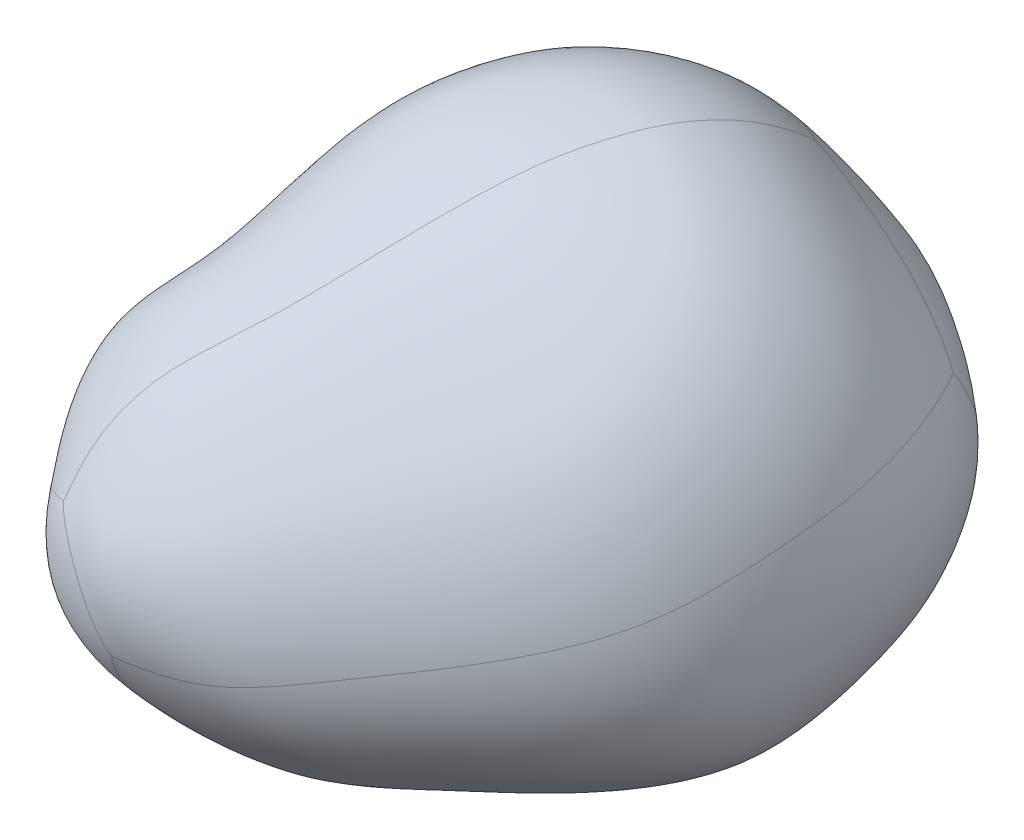
ISO-10303-21;
HEADER;
FILE_DESCRIPTION(('STEP AP214'),'2;1');
FILE_NAME('part.step','',(''),(''),'','','');
FILE_SCHEMA(('AUTOMOTIVE_DESIGN { 1 0 10303 214 1 1 1 1 }'));
ENDSEC;
DATA;
#1=APPLICATION_CONTEXT('core data for automotive mechanical design processes');
#2=APPLICATION_PROTOCOL_DEFINITION('international standard','automotive_design',2000,#1);
#3=PRODUCT_CONTEXT('',#1,'mechanical');
#4=PRODUCT('Part','Part','',(#3));
#5=PRODUCT_RELATED_PRODUCT_CATEGORY('part','',(#4));
#6=PRODUCT_DEFINITION_FORMATION('','',#4);
#7=PRODUCT_DEFINITION_CONTEXT('part definition',#1,'design');
#8=PRODUCT_DEFINITION('design','',#6,#7);
#9=PRODUCT_DEFINITION_SHAPE('','',#8);
#10=(LENGTH_UNIT() NAMED_UNIT(*) SI_UNIT(.MILLI.,.METRE.));
#11=(NAMED_UNIT(*) PLANE_ANGLE_UNIT() SI_UNIT($,.RADIAN.));
#12=(NAMED_UNIT(*) SI_UNIT($,.STERADIAN.) SOLID_ANGLE_UNIT());
#13=UNCERTAINTY_MEASURE_WITH_UNIT(LENGTH_MEASURE(1.E-05),#10,'distance_accuracy_value','');
#14=(GEOMETRIC_REPRESENTATION_CONTEXT(3) GLOBAL_UNCERTAINTY_ASSIGNED_CONTEXT((#13)) GLOBAL_UNIT_ASSIGNED_CONTEXT((#10,
#11,#12)) REPRESENTATION_CONTEXT('',''));
#15=CARTESIAN_POINT('',(0.,0.,0.));
#16=DIRECTION('',(0.,0.,1.));
#17=DIRECTION('',(1.,0.,0.));
#18=AXIS2_PLACEMENT_3D('',#15,#16,#17);
#19=CARTESIAN_POINT('',(-686.42291163055,1282.70666485305,10.6136811677442));
#20=CARTESIAN_POINT('',(-687.093200637764,1282.88853351169,10.5124560797397));
#21=CARTESIAN_POINT('',(-689.119582878825,1283.61745505874,9.80747683091503));
#22=CARTESIAN_POINT('',(-691.409614309493,1286.1212048528,9.66454485203231));
#23=CARTESIAN_POINT('',(-691.8476225779,1288.3002904802,10.2041170140587));
#24=CARTESIAN_POINT('',(-691.908078071692,1288.99320668907,10.2386396299272));
#25=CARTESIAN_POINT('',(-686.114869144333,1282.34408943839,10.1531654192161));
#26=CARTESIAN_POINT('',(-687.147404672565,1282.34525134099,9.49019949464606));
#27=CARTESIAN_POINT('',(-689.34960200637,1282.98717520934,8.4788118063687));
#28=CARTESIAN_POINT('',(-691.877866697639,1285.66932077802,8.35125023060825));
#29=CARTESIAN_POINT('',(-692.253702427534,1288.04240599118,9.23253822877614));
#30=CARTESIAN_POINT('',(-692.141345743401,1289.210722549,9.77011154523115));
#31=CARTESIAN_POINT('',(-684.674634541812,1281.17045683436,8.51633098668324));
#32=CARTESIAN_POINT('',(-686.053718999425,1281.27644974596,7.70583653770232));
#33=CARTESIAN_POINT('',(-689.076122784645,1282.33069227273,6.4876607775005));
#34=CARTESIAN_POINT('',(-692.568304038862,1285.91611908638,6.31859419193949));
#35=CARTESIAN_POINT('',(-693.181903206195,1289.07151461582,7.42484161968595));
#36=CARTESIAN_POINT('',(-693.080789707073,1290.59529470529,8.07253791178796));
#37=CARTESIAN_POINT('',(-681.620453632023,1279.14049088634,4.51940701699092));
#38=CARTESIAN_POINT('',(-683.696286240225,1279.33807292889,3.40556901370574));
#39=CARTESIAN_POINT('',(-688.337675485142,1280.96703779058,1.79116590999492));
#40=CARTESIAN_POINT('',(-693.678791142445,1285.81664285559,1.47380131925525));
#41=CARTESIAN_POINT('',(-694.383414425187,1290.21593355715,3.345163323218));
#42=CARTESIAN_POINT('',(-694.105374323754,1292.37268747619,4.31836859647923));
#43=CARTESIAN_POINT('',(-677.084231777265,1279.14000389249,0.796351925249876));
#44=CARTESIAN_POINT('',(-679.313242319377,1279.22393255586,-0.383227826918756));
#45=CARTESIAN_POINT('',(-684.531380755252,1280.65954170552,-2.13027967370924));
#46=CARTESIAN_POINT('',(-692.291807762562,1286.10757527401,-2.37146180569254));
#47=CARTESIAN_POINT('',(-693.069346619984,1291.02753702183,0.130214183151319));
#48=CARTESIAN_POINT('',(-692.673874841855,1293.47851130268,1.26386509136313));
#49=CARTESIAN_POINT('',(-672.484418517321,1279.160343747,-2.79936903690772));
#50=CARTESIAN_POINT('',(-674.958806307733,1279.18370066044,-3.97698591478032));
#51=CARTESIAN_POINT('',(-681.0144033372,1280.5536472085,-5.65392708944938));
#52=CARTESIAN_POINT('',(-691.860047135952,1286.65307915905,-5.37526087814403));
#53=CARTESIAN_POINT('',(-692.734600000381,1291.92655549921,-2.47703549844126));
#54=CARTESIAN_POINT('',(-692.230934225644,1294.59940439324,-1.28738484312691));
#55=CARTESIAN_POINT('',(-668.427144473369,1279.95245622681,-6.81683013840246));
#56=CARTESIAN_POINT('',(-671.081772309839,1279.91139957004,-7.91989002078143));
#57=CARTESIAN_POINT('',(-677.650013192386,1281.17337774761,-9.44521435466294));
#58=CARTESIAN_POINT('',(-690.762878757641,1288.07081222915,-9.43403816127301));
#59=CARTESIAN_POINT('',(-691.685197110129,1293.49362928346,-6.31268773454909));
#60=CARTESIAN_POINT('',(-691.348352778073,1296.15812834043,-5.12739565255575));
#61=CARTESIAN_POINT('',(-667.387450801063,1281.06373602765,-10.8102788095088));
#62=CARTESIAN_POINT('',(-670.11018795594,1280.98777794852,-11.8602692286205));
#63=CARTESIAN_POINT('',(-676.612947349273,1282.25959659921,-13.2865590274581));
#64=CARTESIAN_POINT('',(-688.590333961783,1289.10053626142,-13.2298024607305));
#65=CARTESIAN_POINT('',(-690.09302408472,1294.81230980328,-10.4858952907197));
#66=CARTESIAN_POINT('',(-689.983872041131,1297.52784683628,-9.38897231943302));
#67=CARTESIAN_POINT('',(-666.794398610092,1283.11117136481,-14.6489177834959));
#68=CARTESIAN_POINT('',(-669.415462502165,1283.0050422679,-15.5803580086399));
#69=CARTESIAN_POINT('',(-675.44724265585,1284.20738289869,-16.8186649282753));
#70=CARTESIAN_POINT('',(-685.542170643042,1290.56526226626,-16.7198798660345));
#71=CARTESIAN_POINT('',(-687.531476708449,1296.20979139775,-14.5245271264415));
#72=CARTESIAN_POINT('',(-687.656808098997,1298.80701812307,-13.5843769834317));
#73=CARTESIAN_POINT('',(-666.142237451677,1285.27283598828,-17.4314258739017));
#74=CARTESIAN_POINT('',(-668.555853562239,1285.19837109628,-18.2840876684652));
#75=CARTESIAN_POINT('',(-674.110296009377,1286.32326986979,-19.5042139428517));
#76=CARTESIAN_POINT('',(-682.728569881099,1292.07812345255,-19.3836341560662));
#77=CARTESIAN_POINT('',(-684.76325754947,1297.21885740554,-17.6152997813946));
#78=CARTESIAN_POINT('',(-684.963731264138,1299.58453153542,-16.7941283890536));
#79=CARTESIAN_POINT('',(-665.861682059292,1288.3609445699,-20.0211985575345));
#80=CARTESIAN_POINT('',(-667.893113435887,1288.32353567233,-20.7333579907715));
#81=CARTESIAN_POINT('',(-672.568032124908,1289.28958610769,-21.8469700343674));
#82=CARTESIAN_POINT('',(-679.086040805524,1294.02486811409,-21.7133620851019));
#83=CARTESIAN_POINT('',(-681.018851553783,1298.28968075662,-20.5000434118361));
#84=CARTESIAN_POINT('',(-681.279950893226,1300.25256135101,-19.8572901379306));
#85=CARTESIAN_POINT('',(-665.552043469771,1291.475283705,-21.1107903059627));
#86=CARTESIAN_POINT('',(-667.074358700396,1291.56764215621,-21.733166431614));
#87=CARTESIAN_POINT('',(-670.575492500916,1292.51853431343,-22.8887551729772));
#88=CARTESIAN_POINT('',(-675.674054926746,1296.32453808077,-22.7112967364734));
#89=CARTESIAN_POINT('',(-677.37018947025,1299.48607415632,-21.5684778709439));
#90=CARTESIAN_POINT('',(-677.715522137071,1300.93555795033,-21.0155570908403));
#91=CARTESIAN_POINT('',(-665.598886444234,1292.20966830191,-21.321841883444));
#92=CARTESIAN_POINT('',(-666.383465546783,1292.62303982597,-21.738555735032));
#93=CARTESIAN_POINT('',(-669.697137822839,1293.90171225334,-22.9821934358503));
#94=CARTESIAN_POINT('',(-674.262867005322,1297.3343262859,-22.784973234695));
#95=CARTESIAN_POINT('',(-676.267293612278,1300.29033670793,-21.6229092356498));
#96=CARTESIAN_POINT('',(-676.865147342805,1300.98857172006,-21.2361515940119));
#97=(BOUNDED_SURFACE() B_SPLINE_SURFACE(3,3,((#19,#20,#21,#22,#23,#24),(#25,#26,#27,#28,#29,
#30),(#31,#32,#33,#34,#35,#36),(#37,#38,#39,#40,#41,#42),(#43,#44,#45,#46,#47,#48),(#49,#50,#51,
#52,#53,#54),(#55,#56,#57,#58,#59,#60),(#61,#62,#63,#64,#65,#66),(#67,#68,#69,#70,#71,#72),(#73,
#74,#75,#76,#77,#78),(#79,#80,#81,#82,#83,#84),(#85,#86,#87,#88,#89,#90),(#91,#92,#93,#94,#95,
#96)),.UNSPECIFIED.,.F.,.F.,.F.) B_SPLINE_SURFACE_WITH_KNOTS((4,1,1,1,1,1,1,1,1,1,4),(4,1,1,4),
(0.,1.,2.,3.,4.,5.,6.,7.,8.,9.,10.),(0.,1.,2.,3.),
.UNSPECIFIED.) GEOMETRIC_REPRESENTATION_ITEM() RATIONAL_B_SPLINE_SURFACE(((0.75,1.,1.,1.,1.,
0.75),(1.,1.,1.,1.,1.,1.),(1.,1.,1.,1.,1.,1.),(1.,1.,1.,1.,1.,1.),(1.,1.,1.,1.,1.,1.),(1.,1.,1.,
1.,1.,1.),(1.,1.,1.,1.,1.,1.),(1.,1.,1.,1.,1.,1.),(1.,1.,1.,1.,1.,1.),(1.,1.,1.,1.,1.,1.),(1.,
1.,1.,1.,1.,1.),(1.,1.,1.,1.,1.,1.),(0.75,1.,1.,1.,1.,0.75))) REPRESENTATION_ITEM('') SURFACE());
#98=CARTESIAN_POINT('',(-686.42291163055,1282.70666485305,10.6136811677442));
#99=CARTESIAN_POINT('',(-686.114869144333,1282.34408943839,10.1531654192161));
#100=CARTESIAN_POINT('',(-684.674634541812,1281.17045683436,8.51633098668324));
#101=CARTESIAN_POINT('',(-681.620453632023,1279.14049088634,4.51940701699092));
#102=CARTESIAN_POINT('',(-677.084231777265,1279.14000389249,0.796351925249876));
#103=CARTESIAN_POINT('',(-672.484418517321,1279.160343747,-2.79936903690772));
#104=CARTESIAN_POINT('',(-668.427144473369,1279.95245622681,-6.81683013840246));
#105=CARTESIAN_POINT('',(-667.387450801063,1281.06373602765,-10.8102788095088));
#106=CARTESIAN_POINT('',(-666.794398610092,1283.11117136481,-14.6489177834959));
#107=CARTESIAN_POINT('',(-666.142237451677,1285.27283598828,-17.4314258739017));
#108=CARTESIAN_POINT('',(-665.861682059292,1288.3609445699,-20.0211985575345));
#109=CARTESIAN_POINT('',(-665.552043469771,1291.475283705,-21.1107903059627));
#110=CARTESIAN_POINT('',(-665.598886444234,1292.20966830191,-21.321841883444));
#111=(BOUNDED_CURVE() B_SPLINE_CURVE(3,(#98,#99,#100,#101,#102,#103,#104,#105,#106,#107,#108,
#109,#110),.UNSPECIFIED.,.F.,.F.) B_SPLINE_CURVE_WITH_KNOTS((4,1,1,1,1,1,1,1,1,1,4),(0.,1.,2.,
3.,4.,5.,6.,7.,8.,9.,10.),
.UNSPECIFIED.) CURVE() GEOMETRIC_REPRESENTATION_ITEM() RATIONAL_B_SPLINE_CURVE((0.75,1.,1.,1.,
1.,1.,1.,1.,1.,1.,1.,1.,0.75)) REPRESENTATION_ITEM(''));
#112=CARTESIAN_POINT('',(-665.598886444234,1292.20966830191,-21.3218418834439));
#113=VERTEX_POINT('',#112);
#114=CARTESIAN_POINT('',(-686.42291163055,1282.70666485305,10.6136811677441));
#115=VERTEX_POINT('',#114);
#116=EDGE_CURVE('E89',#113,#115,#111,.F.);
#117=CARTESIAN_POINT('',(-691.908078071692,1288.99320668907,10.2386396299272));
#118=CARTESIAN_POINT('',(-691.8476225779,1288.3002904802,10.2041170140587));
#119=CARTESIAN_POINT('',(-691.409614309493,1286.1212048528,9.66454485203231));
#120=CARTESIAN_POINT('',(-689.119582878825,1283.61745505874,9.80747683091503));
#121=CARTESIAN_POINT('',(-687.093200637764,1282.88853351169,10.5124560797397));
#122=CARTESIAN_POINT('',(-686.42291163055,1282.70666485305,10.6136811677442));
#123=(BOUNDED_CURVE() B_SPLINE_CURVE(3,(#117,#118,#119,#120,#121,#122),.UNSPECIFIED.,.F.,
.F.) B_SPLINE_CURVE_WITH_KNOTS((4,1,1,4),(0.,1.,2.,3.),
.UNSPECIFIED.) CURVE() GEOMETRIC_REPRESENTATION_ITEM() RATIONAL_B_SPLINE_CURVE((0.75,1.,1.,1.,
1.,0.75)) REPRESENTATION_ITEM(''));
#124=CARTESIAN_POINT('',(-691.908078071692,1288.99320668907,10.2386396299273));
#125=VERTEX_POINT('',#124);
#126=EDGE_CURVE('E150',#115,#125,#123,.F.);
#127=CARTESIAN_POINT('',(-676.865147342805,1300.98857172006,-21.2361515940119));
#128=CARTESIAN_POINT('',(-677.715522137071,1300.93555795033,-21.0155570908403));
#129=CARTESIAN_POINT('',(-681.279950893226,1300.25256135101,-19.8572901379306));
#130=CARTESIAN_POINT('',(-684.963731264138,1299.58453153542,-16.7941283890536));
#131=CARTESIAN_POINT('',(-687.656808098997,1298.80701812307,-13.5843769834317));
#132=CARTESIAN_POINT('',(-689.983872041131,1297.52784683628,-9.38897231943302));
#133=CARTESIAN_POINT('',(-691.348352778073,1296.15812834043,-5.12739565255575));
#134=CARTESIAN_POINT('',(-692.230934225644,1294.59940439324,-1.28738484312691));
#135=CARTESIAN_POINT('',(-692.673874841855,1293.47851130268,1.26386509136313));
#136=CARTESIAN_POINT('',(-694.105374323754,1292.37268747619,4.31836859647923));
#137=CARTESIAN_POINT('',(-693.080789707073,1290.59529470529,8.07253791178796));
#138=CARTESIAN_POINT('',(-692.141345743401,1289.210722549,9.77011154523115));
#139=CARTESIAN_POINT('',(-691.908078071692,1288.99320668907,10.2386396299272));
#140=(BOUNDED_CURVE() B_SPLINE_CURVE(3,(#127,#128,#129,#130,#131,#132,#133,#134,#135,#136,#137,
#138,#139),.UNSPECIFIED.,.F.,.F.) B_SPLINE_CURVE_WITH_KNOTS((4,1,1,1,1,1,1,1,1,1,4),(0.,1.,2.,
3.,4.,5.,6.,7.,8.,9.,10.),
.UNSPECIFIED.) CURVE() GEOMETRIC_REPRESENTATION_ITEM() RATIONAL_B_SPLINE_CURVE((0.75,1.,1.,1.,
1.,1.,1.,1.,1.,1.,1.,1.,0.75)) REPRESENTATION_ITEM(''));
#141=CARTESIAN_POINT('',(-676.865147342805,1300.98857172006,-21.2361515940119));
#142=VERTEX_POINT('',#141);
#143=EDGE_CURVE('E102',#125,#142,#140,.F.);
#144=CARTESIAN_POINT('',(-665.598886444234,1292.20966830191,-21.321841883444));
#145=CARTESIAN_POINT('',(-666.383465546783,1292.62303982597,-21.738555735032));
#146=CARTESIAN_POINT('',(-669.697137822839,1293.90171225334,-22.9821934358503));
#147=CARTESIAN_POINT('',(-674.262867005322,1297.3343262859,-22.784973234695));
#148=CARTESIAN_POINT('',(-676.267293612278,1300.29033670793,-21.6229092356498));
#149=CARTESIAN_POINT('',(-676.865147342805,1300.98857172006,-21.2361515940119));
#150=(BOUNDED_CURVE() B_SPLINE_CURVE(3,(#144,#145,#146,#147,#148,#149),.UNSPECIFIED.,.F.,
.F.) B_SPLINE_CURVE_WITH_KNOTS((4,1,1,4),(0.,1.,2.,3.),
.UNSPECIFIED.) CURVE() GEOMETRIC_REPRESENTATION_ITEM() RATIONAL_B_SPLINE_CURVE((0.75,1.,1.,1.,
1.,0.75)) REPRESENTATION_ITEM(''));
#151=EDGE_CURVE('E101',#142,#113,#150,.F.);
#152=ORIENTED_EDGE('',*,*,#116,.T.);
#153=ORIENTED_EDGE('',*,*,#126,.T.);
#154=ORIENTED_EDGE('',*,*,#143,.T.);
#155=ORIENTED_EDGE('',*,*,#151,.T.);
#156=EDGE_LOOP('',(#152,#153,#154,#155));
#157=FACE_BOUND('',#156,.T.);
#158=ADVANCED_FACE('F40',(#157),#97,.F.);
#159=CARTESIAN_POINT('',(-665.598886444234,1292.20966830191,-21.321841883444));
#160=CARTESIAN_POINT('',(-666.383465546783,1292.62303982597,-21.738555735032));
#161=CARTESIAN_POINT('',(-669.697137822839,1293.90171225334,-22.9821934358503));
#162=CARTESIAN_POINT('',(-674.262867005322,1297.3343262859,-22.784973234695));
#163=CARTESIAN_POINT('',(-676.267293612278,1300.29033670793,-21.6229092356498));
#164=CARTESIAN_POINT('',(-676.865147342805,1300.98857172006,-21.2361515940119));
#165=CARTESIAN_POINT('',(-664.86115031617,1292.53068137475,-21.116179609359));
#166=CARTESIAN_POINT('',(-665.692572393182,1293.67843749572,-21.7439450384282));
#167=CARTESIAN_POINT('',(-668.818783144761,1295.28489019326,-23.0756316987124));
#168=CARTESIAN_POINT('',(-672.851679083909,1298.34411449104,-22.8586497329164));
#169=CARTESIAN_POINT('',(-675.164397754296,1301.09459925954,-21.6773406003557));
#170=CARTESIAN_POINT('',(-676.612626279087,1301.73982050193,-21.0699884555459));
#171=CARTESIAN_POINT('',(-662.594677815706,1293.31015264849,-19.9600961151038));
#172=CARTESIAN_POINT('',(-663.747754514224,1294.65592169084,-20.7656938112249));
#173=CARTESIAN_POINT('',(-667.297904056435,1297.5886537472,-22.4075996116167));
#174=CARTESIAN_POINT('',(-670.618913276992,1300.0835973449,-22.1554210744634));
#175=CARTESIAN_POINT('',(-674.401476405907,1303.11525606632,-20.8266316000605));
#176=CARTESIAN_POINT('',(-676.073763666764,1304.06834845557,-20.1102018279336));
#177=CARTESIAN_POINT('',(-660.926960995874,1295.88388375589,-18.1013294311311));
#178=CARTESIAN_POINT('',(-662.119046255161,1296.9534225298,-19.0722785522677));
#179=CARTESIAN_POINT('',(-665.31051099484,1300.01296458609,-20.452973982058));
#180=CARTESIAN_POINT('',(-668.406067105772,1302.3700931522,-20.3501596015209));
#181=CARTESIAN_POINT('',(-672.190754374226,1305.11899662417,-19.407942003383));
#182=CARTESIAN_POINT('',(-673.525827047994,1306.25660129213,-18.7071390379707));
#183=CARTESIAN_POINT('',(-661.021209873142,1298.02208714574,-17.1648614489135));
#184=CARTESIAN_POINT('',(-661.912434136778,1298.76471151157,-18.0206065657238));
#185=CARTESIAN_POINT('',(-663.92937203237,1301.31011274233,-18.4391264629946));
#186=CARTESIAN_POINT('',(-667.336751897799,1303.93565126776,-18.4453218524157));
#187=CARTESIAN_POINT('',(-670.327421229956,1305.58505983533,-18.3388377803774));
#188=CARTESIAN_POINT('',(-671.227587167795,1306.49458069563,-17.7495212825345));
#189=CARTESIAN_POINT('',(-661.047260040231,1298.61720564721,-16.7166215073291));
#190=CARTESIAN_POINT('',(-661.505897255577,1299.28607708086,-16.9203740949258));
#191=CARTESIAN_POINT('',(-663.286186031787,1301.85419866751,-17.0512913244717));
#192=CARTESIAN_POINT('',(-666.877951441682,1304.74337883645,-17.1884671165909));
#193=CARTESIAN_POINT('',(-669.820629045091,1306.18739743648,-17.4037340005691));
#194=CARTESIAN_POINT('',(-670.589670398601,1306.5929654763,-17.3225575952802));
#195=(BOUNDED_SURFACE() B_SPLINE_SURFACE(3,3,((#159,#160,#161,#162,#163,#164),(#165,#166,#167,
#168,#169,#170),(#171,#172,#173,#174,#175,#176),(#177,#178,#179,#180,#181,#182),(#183,#184,#185,
#186,#187,#188),(#189,#190,#191,#192,#193,#194)),.UNSPECIFIED.,.F.,.F.,
.F.) B_SPLINE_SURFACE_WITH_KNOTS((4,1,1,4),(4,1,1,4),(0.,1.,2.,3.),(0.,1.,2.,3.),
.UNSPECIFIED.) GEOMETRIC_REPRESENTATION_ITEM() RATIONAL_B_SPLINE_SURFACE(((0.75,1.,1.,1.,1.,
0.75),(1.,1.,1.,1.,1.,1.),(1.,1.,1.,1.,1.,1.),(1.,1.,1.,1.,1.,1.),(1.,1.,1.,1.,1.,1.),(0.75,1.,
1.,1.,1.,0.75))) REPRESENTATION_ITEM('') SURFACE());
#196=CARTESIAN_POINT('',(-661.047260040231,1298.61720564721,-16.7166215073291));
#197=CARTESIAN_POINT('',(-661.021209873142,1298.02208714574,-17.1648614489135));
#198=CARTESIAN_POINT('',(-660.926960995874,1295.88388375589,-18.1013294311311));
#199=CARTESIAN_POINT('',(-662.594677815706,1293.31015264849,-19.9600961151038));
#200=CARTESIAN_POINT('',(-664.86115031617,1292.53068137475,-21.116179609359));
#201=CARTESIAN_POINT('',(-665.598886444234,1292.20966830191,-21.321841883444));
#202=(BOUNDED_CURVE() B_SPLINE_CURVE(3,(#196,#197,#198,#199,#200,#201),.UNSPECIFIED.,.F.,
.F.) B_SPLINE_CURVE_WITH_KNOTS((4,1,1,4),(0.,1.,2.,3.),
.UNSPECIFIED.) CURVE() GEOMETRIC_REPRESENTATION_ITEM() RATIONAL_B_SPLINE_CURVE((0.75,1.,1.,1.,
1.,0.75)) REPRESENTATION_ITEM(''));
#203=CARTESIAN_POINT('',(-661.047260040231,1298.61720564721,-16.7166215073291));
#204=VERTEX_POINT('',#203);
#205=EDGE_CURVE('E93',#204,#113,#202,.T.);
#206=CARTESIAN_POINT('',(-670.589670398601,1306.5929654763,-17.3225575952802));
#207=CARTESIAN_POINT('',(-671.227587167795,1306.49458069563,-17.7495212825345));
#208=CARTESIAN_POINT('',(-673.525827047994,1306.25660129213,-18.7071390379707));
#209=CARTESIAN_POINT('',(-676.073763666764,1304.06834845557,-20.1102018279336));
#210=CARTESIAN_POINT('',(-676.612626279087,1301.73982050193,-21.0699884555459));
#211=CARTESIAN_POINT('',(-676.865147342805,1300.98857172006,-21.2361515940119));
#212=(BOUNDED_CURVE() B_SPLINE_CURVE(3,(#206,#207,#208,#209,#210,#211),.UNSPECIFIED.,.F.,
.F.) B_SPLINE_CURVE_WITH_KNOTS((4,1,1,4),(0.,1.,2.,3.),
.UNSPECIFIED.) CURVE() GEOMETRIC_REPRESENTATION_ITEM() RATIONAL_B_SPLINE_CURVE((0.75,1.,1.,1.,
1.,0.75)) REPRESENTATION_ITEM(''));
#213=CARTESIAN_POINT('',(-670.589670398601,1306.5929654763,-17.3225575952802));
#214=VERTEX_POINT('',#213);
#215=EDGE_CURVE('E106',#142,#214,#212,.F.);
#216=CARTESIAN_POINT('',(-661.047260040231,1298.61720564721,-16.7166215073291));
#217=CARTESIAN_POINT('',(-661.505897255577,1299.28607708086,-16.9203740949258));
#218=CARTESIAN_POINT('',(-663.286186031787,1301.85419866751,-17.0512913244717));
#219=CARTESIAN_POINT('',(-666.877951441682,1304.74337883645,-17.1884671165909));
#220=CARTESIAN_POINT('',(-669.820629045091,1306.18739743648,-17.4037340005691));
#221=CARTESIAN_POINT('',(-670.589670398601,1306.5929654763,-17.3225575952802));
#222=(BOUNDED_CURVE() B_SPLINE_CURVE(3,(#216,#217,#218,#219,#220,#221),.UNSPECIFIED.,.F.,
.F.) B_SPLINE_CURVE_WITH_KNOTS((4,1,1,4),(0.,1.,2.,3.),
.UNSPECIFIED.) CURVE() GEOMETRIC_REPRESENTATION_ITEM() RATIONAL_B_SPLINE_CURVE((0.75,1.,1.,1.,
1.,0.75)) REPRESENTATION_ITEM(''));
#223=EDGE_CURVE('E64',#214,#204,#222,.F.);
#224=ORIENTED_EDGE('',*,*,#205,.T.);
#225=ORIENTED_EDGE('',*,*,#151,.F.);
#226=ORIENTED_EDGE('',*,*,#215,.T.);
#227=ORIENTED_EDGE('',*,*,#223,.T.);
#228=EDGE_LOOP('',(#224,#225,#226,#227));
#229=FACE_BOUND('',#228,.T.);
#230=ADVANCED_FACE('F108',(#229),#195,.F.);
#231=CARTESIAN_POINT('',(-670.589670398601,1306.5929654763,-17.3225575952802));
#232=CARTESIAN_POINT('',(-671.227587167795,1306.49458069563,-17.7495212825345));
#233=CARTESIAN_POINT('',(-673.525827047994,1306.25660129213,-18.7071390379707));
#234=CARTESIAN_POINT('',(-676.073763666764,1304.06834845557,-20.1102018279336));
#235=CARTESIAN_POINT('',(-676.612626279087,1301.73982050193,-21.0699884555459));
#236=CARTESIAN_POINT('',(-676.865147342805,1300.98857172006,-21.2361515940119));
#237=CARTESIAN_POINT('',(-670.720794982929,1307.09691829677,-16.8144175027154));
#238=CARTESIAN_POINT('',(-672.127753105623,1307.40410155593,-17.1602047846809));
#239=CARTESIAN_POINT('',(-674.860899721771,1307.39420596011,-18.0063360725369));
#240=CARTESIAN_POINT('',(-677.746050927632,1305.02144084483,-19.3937720558064));
#241=CARTESIAN_POINT('',(-678.060854803879,1302.38504174433,-20.4626363107362));
#242=CARTESIAN_POINT('',(-677.715522137071,1300.93555795033,-21.0155570908403));
#243=CARTESIAN_POINT('',(-670.943874394936,1309.06289933027,-14.3533710948916));
#244=CARTESIAN_POINT('',(-672.737747524842,1309.39277642954,-14.9094228652935));
#245=CARTESIAN_POINT('',(-676.416503148426,1309.19572115999,-16.1453418089727));
#246=CARTESIAN_POINT('',(-680.652636842155,1305.8021516804,-17.8568424416906));
#247=CARTESIAN_POINT('',(-681.541050232659,1302.2154419454,-19.2145368640359));
#248=CARTESIAN_POINT('',(-681.279950893226,1300.25256135101,-19.8572901379306));
#249=CARTESIAN_POINT('',(-671.937724058684,1310.40019115356,-10.8478410952801));
#250=CARTESIAN_POINT('',(-674.051251162919,1310.8753090318,-11.5544925107604));
#251=CARTESIAN_POINT('',(-678.562356158606,1310.82700115015,-13.1141548814003));
#252=CARTESIAN_POINT('',(-683.931412169172,1306.27216823189,-14.4566058019758));
#253=CARTESIAN_POINT('',(-685.164204978817,1301.95020566531,-15.9729569967015));
#254=CARTESIAN_POINT('',(-684.963731264138,1299.58453153542,-16.7941283890536));
#255=CARTESIAN_POINT('',(-672.883719363434,1310.84510204975,-7.62613537351383));
#256=CARTESIAN_POINT('',(-675.163928374108,1311.43106875115,-8.43223753946807));
#257=CARTESIAN_POINT('',(-680.180872597681,1311.535030677,-10.2027565229323));
#258=CARTESIAN_POINT('',(-686.294158986252,1306.14862261812,-11.0789790079982));
#259=CARTESIAN_POINT('',(-687.782139489523,1301.40424484837,-12.644226840433));
#260=CARTESIAN_POINT('',(-687.656808098997,1298.80701812307,-13.5843769834317));
#261=CARTESIAN_POINT('',(-674.488710138043,1310.39114378589,-3.86630726823659));
#262=CARTESIAN_POINT('',(-676.787346957623,1311.1422100833,-4.72365162595091));
#263=CARTESIAN_POINT('',(-681.890068715146,1311.52912961856,-6.5609302677741));
#264=CARTESIAN_POINT('',(-687.93542170023,1305.39375845944,-6.64826463303362));
#265=CARTESIAN_POINT('',(-689.874719997543,1300.24338386929,-8.29204934815748));
#266=CARTESIAN_POINT('',(-689.983872041131,1297.52784683628,-9.38897231943302));
#267=CARTESIAN_POINT('',(-676.097406419018,1309.04444488022,-0.384699277202407));
#268=CARTESIAN_POINT('',(-678.27112585538,1309.91377482493,-1.23982100865127));
#269=CARTESIAN_POINT('',(-683.141484768298,1310.55954790168,-3.02930618172537));
#270=CARTESIAN_POINT('',(-688.741812765264,1304.05780657095,-2.32228566931299));
#271=CARTESIAN_POINT('',(-691.011508446007,1298.82262739739,-3.94210357056239));
#272=CARTESIAN_POINT('',(-691.348352778073,1296.15812834043,-5.12739565255575));
#273=CARTESIAN_POINT('',(-678.366179464934,1306.68037672206,3.89114825467495));
#274=CARTESIAN_POINT('',(-679.981879992573,1307.42881566724,3.25529881718982));
#275=CARTESIAN_POINT('',(-683.421976873993,1307.73380049038,2.50764361927879));
#276=CARTESIAN_POINT('',(-688.83805248756,1302.69017252325,1.76264305372053));
#277=CARTESIAN_POINT('',(-691.727268450906,1297.27225328726,-0.0977341878127449));
#278=CARTESIAN_POINT('',(-692.230934225644,1294.59940439324,-1.28738484312691));
#279=CARTESIAN_POINT('',(-681.145986303727,1303.66517093002,7.82818219309317));
#280=CARTESIAN_POINT('',(-682.44433971325,1304.32829798808,7.11657036402393));
#281=CARTESIAN_POINT('',(-685.205968983378,1304.74590525628,5.98987207822791));
#282=CARTESIAN_POINT('',(-689.918977093755,1300.81342095912,4.43044364361917));
#283=CARTESIAN_POINT('',(-692.278403063716,1295.92948558354,2.39751599958252));
#284=CARTESIAN_POINT('',(-692.673874841855,1293.47851130268,1.26386509136313));
#285=CARTESIAN_POINT('',(-684.578447168176,1301.01298057426,11.5169599105223));
#286=CARTESIAN_POINT('',(-685.716839172822,1301.60393984016,10.731086297993));
#287=CARTESIAN_POINT('',(-688.17419520397,1302.02325301775,9.34296377146349));
#288=CARTESIAN_POINT('',(-692.0105505339,1298.75716636981,7.31303295880244));
#289=CARTESIAN_POINT('',(-693.827334222332,1294.52944139523,5.29157386974063));
#290=CARTESIAN_POINT('',(-694.105374323754,1292.37268747619,4.31836859647923));
#291=CARTESIAN_POINT('',(-686.370506692079,1297.36821362393,14.1240197382748));
#292=CARTESIAN_POINT('',(-687.301789826256,1297.66496034829,13.5106200145943));
#293=CARTESIAN_POINT('',(-689.255283683158,1297.60847713569,12.2415545130472));
#294=CARTESIAN_POINT('',(-691.961623044128,1295.05879962317,10.2047719444642));
#295=CARTESIAN_POINT('',(-692.979676207951,1292.11907479475,8.72023420386803));
#296=CARTESIAN_POINT('',(-693.080789707073,1290.59529470529,8.07253791178796));
#297=CARTESIAN_POINT('',(-686.699916550743,1295.03311691201,15.0642593273752));
#298=CARTESIAN_POINT('',(-687.446320154271,1295.15522879455,14.5550876074943));
#299=CARTESIAN_POINT('',(-689.024446758737,1294.87871572201,13.434257144944));
#300=CARTESIAN_POINT('',(-691.203726592884,1292.67922012488,11.5766901292951));
#301=CARTESIAN_POINT('',(-692.028989059289,1290.37903910681,10.3076848616755));
#302=CARTESIAN_POINT('',(-692.141345743401,1289.210722549,9.77011154523115));
#303=CARTESIAN_POINT('',(-686.845457367366,1294.49009850294,15.2601626725711));
#304=CARTESIAN_POINT('',(-687.291429577425,1294.27964523968,15.1035284852227));
#305=CARTESIAN_POINT('',(-688.868386591592,1293.67297956657,14.0304320053378));
#306=CARTESIAN_POINT('',(-690.836587703871,1291.6073241102,12.2422884586391));
#307=CARTESIAN_POINT('',(-691.735265893767,1289.46860703802,10.7416903305135));
#308=CARTESIAN_POINT('',(-691.908078071692,1288.99320668907,10.2386396299272));
#309=(BOUNDED_SURFACE() B_SPLINE_SURFACE(3,3,((#231,#232,#233,#234,#235,#236),(#237,#238,#239,
#240,#241,#242),(#243,#244,#245,#246,#247,#248),(#249,#250,#251,#252,#253,#254),(#255,#256,#257,
#258,#259,#260),(#261,#262,#263,#264,#265,#266),(#267,#268,#269,#270,#271,#272),(#273,#274,#275,
#276,#277,#278),(#279,#280,#281,#282,#283,#284),(#285,#286,#287,#288,#289,#290),(#291,#292,#293,
#294,#295,#296),(#297,#298,#299,#300,#301,#302),(#303,#304,#305,#306,#307,#308)),.UNSPECIFIED.,
.F.,.F.,.F.) B_SPLINE_SURFACE_WITH_KNOTS((4,1,1,1,1,1,1,1,1,1,4),(4,1,1,4),(0.,1.,2.,3.,4.,5.,
6.,7.,8.,9.,10.),(0.,1.,2.,3.),
.UNSPECIFIED.) GEOMETRIC_REPRESENTATION_ITEM() RATIONAL_B_SPLINE_SURFACE(((0.75,1.,1.,1.,1.,
0.75),(1.,1.,1.,1.,1.,1.),(1.,1.,1.,1.,1.,1.),(1.,1.,1.,1.,1.,1.),(1.,1.,1.,1.,1.,1.),(1.,1.,1.,
1.,1.,1.),(1.,1.,1.,1.,1.,1.),(1.,1.,1.,1.,1.,1.),(1.,1.,1.,1.,1.,1.),(1.,1.,1.,1.,1.,1.),(1.,
1.,1.,1.,1.,1.),(1.,1.,1.,1.,1.,1.),(0.75,1.,1.,1.,1.,0.75))) REPRESENTATION_ITEM('') SURFACE());
#310=CARTESIAN_POINT('',(-670.589670398601,1306.5929654763,-17.3225575952802));
#311=CARTESIAN_POINT('',(-670.720794982929,1307.09691829677,-16.8144175027154));
#312=CARTESIAN_POINT('',(-670.943874394936,1309.06289933027,-14.3533710948916));
#313=CARTESIAN_POINT('',(-671.937724058684,1310.40019115356,-10.8478410952801));
#314=CARTESIAN_POINT('',(-672.883719363434,1310.84510204975,-7.62613537351383));
#315=CARTESIAN_POINT('',(-674.488710138043,1310.39114378589,-3.86630726823659));
#316=CARTESIAN_POINT('',(-676.097406419018,1309.04444488022,-0.384699277202407));
#317=CARTESIAN_POINT('',(-678.366179464934,1306.68037672206,3.89114825467495));
#318=CARTESIAN_POINT('',(-681.145986303727,1303.66517093002,7.82818219309317));
#319=CARTESIAN_POINT('',(-684.578447168176,1301.01298057426,11.5169599105223));
#320=CARTESIAN_POINT('',(-686.370506692079,1297.36821362393,14.1240197382748));
#321=CARTESIAN_POINT('',(-686.699916550743,1295.03311691201,15.0642593273752));
#322=CARTESIAN_POINT('',(-686.845457367366,1294.49009850294,15.2601626725711));
#323=(BOUNDED_CURVE() B_SPLINE_CURVE(3,(#310,#311,#312,#313,#314,#315,#316,#317,#318,#319,#320,
#321,#322),.UNSPECIFIED.,.F.,.F.) B_SPLINE_CURVE_WITH_KNOTS((4,1,1,1,1,1,1,1,1,1,4),(0.,1.,2.,
3.,4.,5.,6.,7.,8.,9.,10.),
.UNSPECIFIED.) CURVE() GEOMETRIC_REPRESENTATION_ITEM() RATIONAL_B_SPLINE_CURVE((0.75,1.,1.,1.,
1.,1.,1.,1.,1.,1.,1.,1.,0.75)) REPRESENTATION_ITEM(''));
#324=CARTESIAN_POINT('',(-686.845457367365,1294.49009850294,15.2601626725709));
#325=VERTEX_POINT('',#324);
#326=EDGE_CURVE('E114',#325,#214,#323,.F.);
#327=CARTESIAN_POINT('',(-686.845457367366,1294.49009850294,15.2601626725711));
#328=CARTESIAN_POINT('',(-687.291429577425,1294.27964523968,15.1035284852227));
#329=CARTESIAN_POINT('',(-688.868386591592,1293.67297956657,14.0304320053378));
#330=CARTESIAN_POINT('',(-690.836587703871,1291.6073241102,12.2422884586391));
#331=CARTESIAN_POINT('',(-691.735265893767,1289.46860703802,10.7416903305135));
#332=CARTESIAN_POINT('',(-691.908078071692,1288.99320668907,10.2386396299272));
#333=(BOUNDED_CURVE() B_SPLINE_CURVE(3,(#327,#328,#329,#330,#331,#332),.UNSPECIFIED.,.F.,
.F.) B_SPLINE_CURVE_WITH_KNOTS((4,1,1,4),(0.,1.,2.,3.),
.UNSPECIFIED.) CURVE() GEOMETRIC_REPRESENTATION_ITEM() RATIONAL_B_SPLINE_CURVE((0.75,1.,1.,1.,
1.,0.75)) REPRESENTATION_ITEM(''));
#334=EDGE_CURVE('E141',#125,#325,#333,.F.);
#335=ORIENTED_EDGE('',*,*,#326,.T.);
#336=ORIENTED_EDGE('',*,*,#215,.F.);
#337=ORIENTED_EDGE('',*,*,#143,.F.);
#338=ORIENTED_EDGE('',*,*,#334,.T.);
#339=EDGE_LOOP('',(#335,#336,#337,#338));
#340=FACE_BOUND('',#339,.T.);
#341=ADVANCED_FACE('F189',(#340),#309,.F.);
#342=CARTESIAN_POINT('',(-686.845457367366,1294.49009850294,15.2601626725711));
#343=CARTESIAN_POINT('',(-687.291429577425,1294.27964523968,15.1035284852227));
#344=CARTESIAN_POINT('',(-688.868386591592,1293.67297956657,14.0304320053378));
#345=CARTESIAN_POINT('',(-690.836587703871,1291.6073241102,12.2422884586391));
#346=CARTESIAN_POINT('',(-691.735265893767,1289.46860703802,10.7416903305135));
#347=CARTESIAN_POINT('',(-691.908078071692,1288.99320668907,10.2386396299272));
#348=CARTESIAN_POINT('',(-686.545025973897,1294.15753335715,15.6127002051037));
#349=CARTESIAN_POINT('',(-687.136539000578,1293.4040616848,15.6519693629733));
#350=CARTESIAN_POINT('',(-688.712326424469,1292.46724341111,14.6266068657424));
#351=CARTESIAN_POINT('',(-690.469448814847,1290.53542809552,12.907886787972));
#352=CARTESIAN_POINT('',(-691.441542728244,1288.55817496922,11.175695799352));
#353=CARTESIAN_POINT('',(-691.8476225779,1288.3002904802,10.2041170140587));
#354=CARTESIAN_POINT('',(-685.321248104631,1293.23705499576,16.4720626008875));
#355=CARTESIAN_POINT('',(-686.096471071663,1292.32806556466,16.4548377376119));
#356=CARTESIAN_POINT('',(-688.042947386833,1290.29066674856,15.4721761320562));
#357=CARTESIAN_POINT('',(-689.482814416495,1288.54403008068,13.8519343771191));
#358=CARTESIAN_POINT('',(-690.941361921347,1286.57308892759,10.977839473478));
#359=CARTESIAN_POINT('',(-691.409614309493,1286.1212048528,9.66454485203231));
#360=CARTESIAN_POINT('',(-683.640967515003,1290.92979431125,17.0556389729563));
#361=CARTESIAN_POINT('',(-684.470281109803,1290.14648627413,16.9331915375348));
#362=CARTESIAN_POINT('',(-686.116764394156,1287.82430594045,15.8419867699777));
#363=CARTESIAN_POINT('',(-687.420032725849,1286.02897791476,14.1132233814161));
#364=CARTESIAN_POINT('',(-688.889563751279,1284.24773490816,11.1361418554728));
#365=CARTESIAN_POINT('',(-689.119582878825,1283.61745505874,9.80747683091503));
#366=CARTESIAN_POINT('',(-682.789357887488,1289.09422127045,16.7423012065751));
#367=CARTESIAN_POINT('',(-683.468417841388,1288.5425557094,16.6217702015925));
#368=CARTESIAN_POINT('',(-684.095935140108,1286.53794274068,15.5683382490475));
#369=CARTESIAN_POINT('',(-685.452519497102,1284.45274931578,13.4929485048226));
#370=CARTESIAN_POINT('',(-687.038996602962,1283.4318156824,11.5347126648333));
#371=CARTESIAN_POINT('',(-687.093200637764,1282.88853351169,10.5124560797397));
#372=CARTESIAN_POINT('',(-682.441919935042,1288.58380245165,16.5400872129851));
#373=CARTESIAN_POINT('',(-682.607730935753,1288.0527602617,16.3787147136933));
#374=CARTESIAN_POINT('',(-682.908913674938,1286.0011395183,15.2824528500724));
#375=CARTESIAN_POINT('',(-684.303454167012,1283.71647655478,12.9747779292566));
#376=CARTESIAN_POINT('',(-686.06066510952,1282.88737160909,11.1754220042987));
#377=CARTESIAN_POINT('',(-686.42291163055,1282.70666485305,10.6136811677442));
#378=(BOUNDED_SURFACE() B_SPLINE_SURFACE(3,3,((#342,#343,#344,#345,#346,#347),(#348,#349,#350,
#351,#352,#353),(#354,#355,#356,#357,#358,#359),(#360,#361,#362,#363,#364,#365),(#366,#367,#368,
#369,#370,#371),(#372,#373,#374,#375,#376,#377)),.UNSPECIFIED.,.F.,.F.,
.F.) B_SPLINE_SURFACE_WITH_KNOTS((4,1,1,4),(4,1,1,4),(0.,1.,2.,3.),(0.,1.,2.,3.),
.UNSPECIFIED.) GEOMETRIC_REPRESENTATION_ITEM() RATIONAL_B_SPLINE_SURFACE(((0.75,1.,1.,1.,1.,
0.75),(1.,1.,1.,1.,1.,1.),(1.,1.,1.,1.,1.,1.),(1.,1.,1.,1.,1.,1.),(1.,1.,1.,1.,1.,1.),(0.75,1.,
1.,1.,1.,0.75))) REPRESENTATION_ITEM('') SURFACE());
#379=CARTESIAN_POINT('',(-682.441919935042,1288.58380245165,16.5400872129851));
#380=CARTESIAN_POINT('',(-682.789357887488,1289.09422127045,16.7423012065751));
#381=CARTESIAN_POINT('',(-683.640967515003,1290.92979431125,17.0556389729563));
#382=CARTESIAN_POINT('',(-685.321248104631,1293.23705499576,16.4720626008875));
#383=CARTESIAN_POINT('',(-686.545025973897,1294.15753335715,15.6127002051037));
#384=CARTESIAN_POINT('',(-686.845457367366,1294.49009850294,15.2601626725711));
#385=(BOUNDED_CURVE() B_SPLINE_CURVE(3,(#379,#380,#381,#382,#383,#384),.UNSPECIFIED.,.F.,
.F.) B_SPLINE_CURVE_WITH_KNOTS((4,1,1,4),(0.,1.,2.,3.),
.UNSPECIFIED.) CURVE() GEOMETRIC_REPRESENTATION_ITEM() RATIONAL_B_SPLINE_CURVE((0.75,1.,1.,1.,
1.,0.75)) REPRESENTATION_ITEM(''));
#386=CARTESIAN_POINT('',(-682.441919935042,1288.58380245165,16.5400872129852));
#387=VERTEX_POINT('',#386);
#388=EDGE_CURVE('E54',#387,#325,#385,.T.);
#389=CARTESIAN_POINT('',(-682.441919935042,1288.58380245165,16.5400872129851));
#390=CARTESIAN_POINT('',(-682.607730935753,1288.0527602617,16.3787147136933));
#391=CARTESIAN_POINT('',(-682.908913674938,1286.0011395183,15.2824528500724));
#392=CARTESIAN_POINT('',(-684.303454167012,1283.71647655478,12.9747779292566));
#393=CARTESIAN_POINT('',(-686.06066510952,1282.88737160909,11.1754220042987));
#394=CARTESIAN_POINT('',(-686.42291163055,1282.70666485305,10.6136811677442));
#395=(BOUNDED_CURVE() B_SPLINE_CURVE(3,(#389,#390,#391,#392,#393,#394),.UNSPECIFIED.,.F.,
.F.) B_SPLINE_CURVE_WITH_KNOTS((4,1,1,4),(0.,1.,2.,3.),
.UNSPECIFIED.) CURVE() GEOMETRIC_REPRESENTATION_ITEM() RATIONAL_B_SPLINE_CURVE((0.75,1.,1.,1.,
1.,0.75)) REPRESENTATION_ITEM(''));
#396=EDGE_CURVE('E95',#115,#387,#395,.F.);
#397=ORIENTED_EDGE('',*,*,#388,.T.);
#398=ORIENTED_EDGE('',*,*,#334,.F.);
#399=ORIENTED_EDGE('',*,*,#126,.F.);
#400=ORIENTED_EDGE('',*,*,#396,.T.);
#401=EDGE_LOOP('',(#397,#398,#399,#400));
#402=FACE_BOUND('',#401,.T.);
#403=ADVANCED_FACE('F186',(#402),#378,.F.);
#404=CARTESIAN_POINT('',(-682.441919935042,1288.58380245165,16.5400872129851));
#405=CARTESIAN_POINT('',(-682.607730935753,1288.0527602617,16.3787147136933));
#406=CARTESIAN_POINT('',(-682.908913674938,1286.0011395183,15.2824528500724));
#407=CARTESIAN_POINT('',(-684.303454167012,1283.71647655478,12.9747779292566));
#408=CARTESIAN_POINT('',(-686.06066510952,1282.88737160909,11.1754220042987));
#409=CARTESIAN_POINT('',(-686.42291163055,1282.70666485305,10.6136811677442));
#410=CARTESIAN_POINT('',(-681.928670981852,1288.60442582276,16.499245718665));
#411=CARTESIAN_POINT('',(-681.747044030127,1287.56296481402,16.1356592258049));
#412=CARTESIAN_POINT('',(-681.721892209767,1285.4643362959,14.9965674511195));
#413=CARTESIAN_POINT('',(-683.154388836933,1282.98020379378,12.4566073536692));
#414=CARTESIAN_POINT('',(-685.08233361609,1282.34292753579,10.8161313437644));
#415=CARTESIAN_POINT('',(-686.114869144333,1282.34408943839,10.1531654192161));
#416=CARTESIAN_POINT('',(-679.939842839869,1288.61121830193,16.2296189879119));
#417=CARTESIAN_POINT('',(-679.5821349695,1287.29110704242,15.8212861535265));
#418=CARTESIAN_POINT('',(-679.270610896627,1284.68688006053,14.4731019196124));
#419=CARTESIAN_POINT('',(-680.801616038879,1281.69473480318,11.3506274713861));
#420=CARTESIAN_POINT('',(-683.295550084177,1281.06446392278,9.32682543565326));
#421=CARTESIAN_POINT('',(-684.674634541812,1281.17045683436,8.51633098668324));
#422=CARTESIAN_POINT('',(-676.14552710953,1288.9824620031,15.1687852692193));
#423=CARTESIAN_POINT('',(-675.459119908744,1287.26656106262,14.6821297027339));
#424=CARTESIAN_POINT('',(-674.471400932203,1283.93613363403,12.9220966535067));
#425=CARTESIAN_POINT('',(-675.882679835887,1279.7815455353,8.47419392973608));
#426=CARTESIAN_POINT('',(-679.54462102381,1278.94290884379,5.63324502027626));
#427=CARTESIAN_POINT('',(-681.620453632023,1279.14049088634,4.51940701699092));
#428=CARTESIAN_POINT('',(-671.614653232318,1290.31191884186,11.6891705391257));
#429=CARTESIAN_POINT('',(-670.842215331194,1288.43578499833,11.2452479458914));
#430=CARTESIAN_POINT('',(-669.695444894945,1284.79836501687,9.50934639124808));
#431=CARTESIAN_POINT('',(-671.157317502617,1280.15596972528,4.94719883932789));
#432=CARTESIAN_POINT('',(-674.855221235165,1279.05607522911,1.97593167742361));
#433=CARTESIAN_POINT('',(-677.084231777265,1279.14000389249,0.796351925249876));
#434=CARTESIAN_POINT('',(-667.012783453786,1291.55306173483,8.17610985250829));
#435=CARTESIAN_POINT('',(-666.132306703413,1289.50160475387,7.78613653570565));
#436=CARTESIAN_POINT('',(-664.79886922524,1285.52201522829,6.11425400300926));
#437=CARTESIAN_POINT('',(-666.168076594687,1280.41350572786,1.41177417780086));
#438=CARTESIAN_POINT('',(-670.01003072691,1279.13698683356,-1.6217521590243));
#439=CARTESIAN_POINT('',(-672.484418517321,1279.160343747,-2.79936903690772));
#440=CARTESIAN_POINT('',(-662.482649737058,1293.12577893797,3.78145481353201));
#441=CARTESIAN_POINT('',(-661.592697874944,1290.95688528346,3.37604022473033));
#442=CARTESIAN_POINT('',(-660.271925050286,1286.76044940393,1.77860574425451));
#443=CARTESIAN_POINT('',(-661.722246173564,1281.41971768824,-2.82685506038833));
#444=CARTESIAN_POINT('',(-665.772516636899,1279.99351288357,-5.71377025602302));
#445=CARTESIAN_POINT('',(-668.427144473369,1279.95245622681,-6.81683013840246));
#446=CARTESIAN_POINT('',(-660.243036485074,1294.82847440329,-0.271859263186691));
#447=CARTESIAN_POINT('',(-659.418212193231,1292.62607312333,-0.756124336483621));
#448=CARTESIAN_POINT('',(-658.334268809972,1288.29361549943,-2.47021604766455));
#449=CARTESIAN_POINT('',(-660.276524420039,1282.71534507395,-6.98661651278799));
#450=CARTESIAN_POINT('',(-664.664713646184,1281.13969410677,-9.76028839039708));
#451=CARTESIAN_POINT('',(-667.387450801063,1281.06373602765,-10.8102788095088));
#452=CARTESIAN_POINT('',(-658.918409685197,1296.5862121909,-4.85599051689291));
#453=CARTESIAN_POINT('',(-658.187219737526,1294.51039763789,-5.36046482250836));
#454=CARTESIAN_POINT('',(-657.407873405515,1290.31206263399,-7.08433823262444));
#455=CARTESIAN_POINT('',(-659.720859303408,1284.8441574801,-11.2300235774217));
#456=CARTESIAN_POINT('',(-664.173334718018,1283.21730046171,-13.7174775583517));
#457=CARTESIAN_POINT('',(-666.794398610092,1283.11117136481,-14.6489177834959));
#458=CARTESIAN_POINT('',(-658.564615306343,1297.50663547896,-8.65044302060499));
#459=CARTESIAN_POINT('',(-657.900554012309,1295.59264288417,-9.12842432780085));
#460=CARTESIAN_POINT('',(-657.276294829519,1291.72414505291,-10.7088727221136));
#461=CARTESIAN_POINT('',(-659.628599345992,1286.77005922184,-14.3882431753841));
#462=CARTESIAN_POINT('',(-663.728621341115,1285.3473008803,-16.5787640793167));
#463=CARTESIAN_POINT('',(-666.142237451677,1285.27283598828,-17.4314258739017));
#464=CARTESIAN_POINT('',(-659.130925709228,1298.46799124644,-12.8877697448438));
#465=CARTESIAN_POINT('',(-658.582026450523,1296.85436654733,-13.3046557622301));
#466=CARTESIAN_POINT('',(-658.157999439168,1293.59573194254,-14.6272792552376));
#467=CARTESIAN_POINT('',(-660.379443865335,1289.51403949307,-17.5740134349345));
#468=CARTESIAN_POINT('',(-663.830250682686,1288.39835346746,-19.3090391242973));
#469=CARTESIAN_POINT('',(-665.861682059292,1288.3609445699,-20.0211985575345));
#470=CARTESIAN_POINT('',(-660.614672991941,1298.54345271503,-16.0646289781154));
#471=CARTESIAN_POINT('',(-660.129985609496,1297.2794627799,-16.3091163321248));
#472=CARTESIAN_POINT('',(-659.734875736597,1294.81434498196,-17.1303803099944));
#473=CARTESIAN_POINT('',(-661.441601117198,1291.96438360613,-19.1544984189937));
#474=CARTESIAN_POINT('',(-664.029728239146,1291.38292525379,-20.4884141802899));
#475=CARTESIAN_POINT('',(-665.552043469771,1291.475283705,-21.1107903059627));
#476=CARTESIAN_POINT('',(-661.047260040231,1298.61720564721,-16.7166215073291));
#477=CARTESIAN_POINT('',(-661.021209873142,1298.02208714574,-17.1648614489135));
#478=CARTESIAN_POINT('',(-660.926960995874,1295.88388375589,-18.1013294311311));
#479=CARTESIAN_POINT('',(-662.594677815706,1293.31015264849,-19.9600961151038));
#480=CARTESIAN_POINT('',(-664.86115031617,1292.53068137475,-21.116179609359));
#481=CARTESIAN_POINT('',(-665.598886444234,1292.20966830191,-21.321841883444));
#482=(BOUNDED_SURFACE() B_SPLINE_SURFACE(3,3,((#404,#405,#406,#407,#408,#409),(#410,#411,#412,
#413,#414,#415),(#416,#417,#418,#419,#420,#421),(#422,#423,#424,#425,#426,#427),(#428,#429,#430,
#431,#432,#433),(#434,#435,#436,#437,#438,#439),(#440,#441,#442,#443,#444,#445),(#446,#447,#448,
#449,#450,#451),(#452,#453,#454,#455,#456,#457),(#458,#459,#460,#461,#462,#463),(#464,#465,#466,
#467,#468,#469),(#470,#471,#472,#473,#474,#475),(#476,#477,#478,#479,#480,#481)),.UNSPECIFIED.,
.F.,.F.,.F.) B_SPLINE_SURFACE_WITH_KNOTS((4,1,1,1,1,1,1,1,1,1,4),(4,1,1,4),(0.,1.,2.,3.,4.,5.,
6.,7.,8.,9.,10.),(0.,1.,2.,3.),
.UNSPECIFIED.) GEOMETRIC_REPRESENTATION_ITEM() RATIONAL_B_SPLINE_SURFACE(((0.75,1.,1.,1.,1.,
0.75),(1.,1.,1.,1.,1.,1.),(1.,1.,1.,1.,1.,1.),(1.,1.,1.,1.,1.,1.),(1.,1.,1.,1.,1.,1.),(1.,1.,1.,
1.,1.,1.),(1.,1.,1.,1.,1.,1.),(1.,1.,1.,1.,1.,1.),(1.,1.,1.,1.,1.,1.),(1.,1.,1.,1.,1.,1.),(1.,
1.,1.,1.,1.,1.),(1.,1.,1.,1.,1.,1.),(0.75,1.,1.,1.,1.,0.75))) REPRESENTATION_ITEM('') SURFACE());
#483=CARTESIAN_POINT('',(-661.047260040231,1298.61720564721,-16.7166215073291));
#484=CARTESIAN_POINT('',(-660.614672991941,1298.54345271503,-16.0646289781154));
#485=CARTESIAN_POINT('',(-659.130925709228,1298.46799124644,-12.8877697448438));
#486=CARTESIAN_POINT('',(-658.564615306343,1297.50663547896,-8.65044302060499));
#487=CARTESIAN_POINT('',(-658.918409685197,1296.5862121909,-4.85599051689291));
#488=CARTESIAN_POINT('',(-660.243036485074,1294.82847440329,-0.271859263186691));
#489=CARTESIAN_POINT('',(-662.482649737058,1293.12577893797,3.78145481353201));
#490=CARTESIAN_POINT('',(-667.012783453786,1291.55306173483,8.17610985250829));
#491=CARTESIAN_POINT('',(-671.614653232318,1290.31191884186,11.6891705391257));
#492=CARTESIAN_POINT('',(-676.14552710953,1288.9824620031,15.1687852692193));
#493=CARTESIAN_POINT('',(-679.939842839869,1288.61121830193,16.2296189879119));
#494=CARTESIAN_POINT('',(-681.928670981852,1288.60442582276,16.499245718665));
#495=CARTESIAN_POINT('',(-682.441919935042,1288.58380245165,16.5400872129851));
#496=(BOUNDED_CURVE() B_SPLINE_CURVE(3,(#483,#484,#485,#486,#487,#488,#489,#490,#491,#492,#493,
#494,#495),.UNSPECIFIED.,.F.,.F.) B_SPLINE_CURVE_WITH_KNOTS((4,1,1,1,1,1,1,1,1,1,4),(0.,1.,2.,
3.,4.,5.,6.,7.,8.,9.,10.),
.UNSPECIFIED.) CURVE() GEOMETRIC_REPRESENTATION_ITEM() RATIONAL_B_SPLINE_CURVE((0.75,1.,1.,1.,
1.,1.,1.,1.,1.,1.,1.,1.,0.75)) REPRESENTATION_ITEM(''));
#497=EDGE_CURVE('E11',#204,#387,#496,.T.);
#498=ORIENTED_EDGE('',*,*,#497,.T.);
#499=ORIENTED_EDGE('',*,*,#396,.F.);
#500=ORIENTED_EDGE('',*,*,#116,.F.);
#501=ORIENTED_EDGE('',*,*,#205,.F.);
#502=EDGE_LOOP('',(#498,#499,#500,#501));
#503=FACE_BOUND('',#502,.T.);
#504=ADVANCED_FACE('F91',(#503),#482,.F.);
#505=CARTESIAN_POINT('',(-661.047260040231,1298.61720564721,-16.7166215073291));
#506=CARTESIAN_POINT('',(-661.505897255577,1299.28607708086,-16.9203740949258));
#507=CARTESIAN_POINT('',(-663.286186031787,1301.85419866751,-17.0512913244717));
#508=CARTESIAN_POINT('',(-666.877951441682,1304.74337883645,-17.1884671165909));
#509=CARTESIAN_POINT('',(-669.820629045091,1306.18739743648,-17.4037340005691));
#510=CARTESIAN_POINT('',(-670.589670398601,1306.5929654763,-17.3225575952802));
#511=CARTESIAN_POINT('',(-660.614672991941,1298.54345271503,-16.0646289781154));
#512=CARTESIAN_POINT('',(-661.099360374376,1299.80744265014,-15.820141624117));
#513=CARTESIAN_POINT('',(-662.643000031215,1302.39828459269,-15.6634561859487));
#514=CARTESIAN_POINT('',(-666.419150985565,1305.55110640516,-15.9316123807661));
#515=CARTESIAN_POINT('',(-669.313836860225,1306.78973503762,-16.4686302207499));
#516=CARTESIAN_POINT('',(-670.720794982929,1307.09691829677,-16.8144175027154));
#517=CARTESIAN_POINT('',(-659.130925709228,1298.46799124644,-12.8877697448438));
#518=CARTESIAN_POINT('',(-659.679824967922,1300.08161594554,-12.4708837274684));
#519=CARTESIAN_POINT('',(-661.451394991352,1303.27748013718,-12.1259631509532));
#520=CARTESIAN_POINT('',(-665.653264369048,1307.21645856438,-12.8090311865721));
#521=CARTESIAN_POINT('',(-669.150001265042,1308.733022231,-13.7973193245007));
#522=CARTESIAN_POINT('',(-670.943874394936,1309.06289933027,-14.3533710948916));
#523=CARTESIAN_POINT('',(-658.564615306343,1297.50663547896,-8.65044302060499));
#524=CARTESIAN_POINT('',(-659.228676600386,1299.42062807375,-8.17246171340882));
#525=CARTESIAN_POINT('',(-661.26066259376,1303.20810062166,-7.84098487895901));
#526=CARTESIAN_POINT('',(-665.881193533105,1307.97629388069,-8.87424638854037));
#527=CARTESIAN_POINT('',(-669.824196954426,1309.92507327532,-10.1411896797996));
#528=CARTESIAN_POINT('',(-671.937724058684,1310.40019115356,-10.8478410952801));
#529=CARTESIAN_POINT('',(-658.918409685197,1296.5862121909,-4.85599051689291));
#530=CARTESIAN_POINT('',(-659.649599632867,1298.66202674392,-4.35151621128834));
#531=CARTESIAN_POINT('',(-661.795013091548,1302.76694995207,-4.05749239898664));
#532=CARTESIAN_POINT('',(-666.499618533665,1308.01923046863,-5.36614352716528));
#533=CARTESIAN_POINT('',(-670.603510352759,1310.25913534836,-6.82003320756008));
#534=CARTESIAN_POINT('',(-672.883719363434,1310.84510204975,-7.62613537351383));
#535=CARTESIAN_POINT('',(-660.243036485074,1294.82847440329,-0.271859263186691));
#536=CARTESIAN_POINT('',(-661.067860776906,1297.03087568326,0.212405810110229));
#537=CARTESIAN_POINT('',(-663.283214560984,1301.50802317922,0.435374392114571));
#538=CARTESIAN_POINT('',(-668.098247797671,1307.02273183421,-1.41686412152095));
#539=CARTESIAN_POINT('',(-672.190073318453,1309.64007748849,-3.00896291053337));
#540=CARTESIAN_POINT('',(-674.488710138043,1310.39114378589,-3.86630726823659));
#541=CARTESIAN_POINT('',(-662.482649737058,1293.12577893797,3.78145481353201));
#542=CARTESIAN_POINT('',(-663.372601599192,1295.29467259248,4.18686940232282));
#543=CARTESIAN_POINT('',(-665.611636223041,1299.77381133096,4.21109327702118));
#544=CARTESIAN_POINT('',(-670.099168150106,1305.34356823338,2.10142420693392));
#545=CARTESIAN_POINT('',(-673.923686982645,1308.1751149355,0.470422454251865));
#546=CARTESIAN_POINT('',(-676.097406419018,1309.04444488022,-0.384699277202407));
#547=CARTESIAN_POINT('',(-667.012783453786,1291.55306173483,8.17610985250829));
#548=CARTESIAN_POINT('',(-667.893260204136,1293.60451871579,8.56608316930028));
#549=CARTESIAN_POINT('',(-670.081729727431,1297.83075711404,8.45409390378219));
#550=CARTESIAN_POINT('',(-673.727773708206,1303.24316681925,6.32274024412335));
#551=CARTESIAN_POINT('',(-676.750478937307,1305.93193777686,4.52699769214894));
#552=CARTESIAN_POINT('',(-678.366179464934,1306.68037672206,3.89114825467495));
#553=CARTESIAN_POINT('',(-671.614653232318,1290.31191884186,11.6891705391257));
#554=CARTESIAN_POINT('',(-672.38709113343,1292.18805268538,12.1330931323598));
#555=CARTESIAN_POINT('',(-674.330072301608,1296.05516807803,12.1728819506426));
#556=CARTESIAN_POINT('',(-677.415848526287,1300.76714290785,10.2595430525884));
#557=CARTESIAN_POINT('',(-679.847632894216,1303.00204387194,8.53979402215125));
#558=CARTESIAN_POINT('',(-681.145986303727,1303.66517093002,7.82818219309317));
#559=CARTESIAN_POINT('',(-676.14552710953,1288.9824620031,15.1687852692193));
#560=CARTESIAN_POINT('',(-676.831934310315,1290.69836294359,15.655440835705));
#561=CARTESIAN_POINT('',(-678.589844136864,1294.23153927695,15.842030052431));
#562=CARTESIAN_POINT('',(-681.343843176088,1298.47749742233,14.0582054465952));
#563=CARTESIAN_POINT('',(-683.440055163521,1300.42202130835,12.3028335230515));
#564=CARTESIAN_POINT('',(-684.578447168176,1301.01298057426,11.5169599105223));
#565=CARTESIAN_POINT('',(-679.939842839869,1288.61121830193,16.2296189879119));
#566=CARTESIAN_POINT('',(-680.297550710239,1289.93132956144,16.6379518222863));
#567=CARTESIAN_POINT('',(-681.416858118856,1292.60754761759,16.9230989259245));
#568=CARTESIAN_POINT('',(-683.667584878107,1295.82799678957,15.921952855119));
#569=CARTESIAN_POINT('',(-685.439223557913,1297.07146689959,14.7374194619551));
#570=CARTESIAN_POINT('',(-686.370506692079,1297.36821362393,14.1240197382748));
#571=CARTESIAN_POINT('',(-681.928670981852,1288.60442582276,16.499245718665));
#572=CARTESIAN_POINT('',(-682.110297933598,1289.64588683151,16.8628322115575));
#573=CARTESIAN_POINT('',(-682.811653920202,1291.71310234837,17.1780864083776));
#574=CARTESIAN_POINT('',(-684.546025137598,1294.14604442686,16.4892874641634));
#575=CARTESIAN_POINT('',(-685.953512947225,1294.91100502949,15.5734310472342));
#576=CARTESIAN_POINT('',(-686.699916550743,1295.03311691201,15.0642593273752));
#577=CARTESIAN_POINT('',(-682.441919935042,1288.58380245165,16.5400872129851));
#578=CARTESIAN_POINT('',(-682.789357887488,1289.09422127045,16.7423012065751));
#579=CARTESIAN_POINT('',(-683.640967515003,1290.92979431125,17.0556389729563));
#580=CARTESIAN_POINT('',(-685.321248104631,1293.23705499576,16.4720626008875));
#581=CARTESIAN_POINT('',(-686.545025973897,1294.15753335715,15.6127002051037));
#582=CARTESIAN_POINT('',(-686.845457367366,1294.49009850294,15.2601626725711));
#583=(BOUNDED_SURFACE() B_SPLINE_SURFACE(3,3,((#505,#506,#507,#508,#509,#510),(#511,#512,#513,
#514,#515,#516),(#517,#518,#519,#520,#521,#522),(#523,#524,#525,#526,#527,#528),(#529,#530,#531,
#532,#533,#534),(#535,#536,#537,#538,#539,#540),(#541,#542,#543,#544,#545,#546),(#547,#548,#549,
#550,#551,#552),(#553,#554,#555,#556,#557,#558),(#559,#560,#561,#562,#563,#564),(#565,#566,#567,
#568,#569,#570),(#571,#572,#573,#574,#575,#576),(#577,#578,#579,#580,#581,#582)),.UNSPECIFIED.,
.F.,.F.,.F.) B_SPLINE_SURFACE_WITH_KNOTS((4,1,1,1,1,1,1,1,1,1,4),(4,1,1,4),(0.,1.,2.,3.,4.,5.,
6.,7.,8.,9.,10.),(0.,1.,2.,3.),
.UNSPECIFIED.) GEOMETRIC_REPRESENTATION_ITEM() RATIONAL_B_SPLINE_SURFACE(((0.75,1.,1.,1.,1.,
0.75),(1.,1.,1.,1.,1.,1.),(1.,1.,1.,1.,1.,1.),(1.,1.,1.,1.,1.,1.),(1.,1.,1.,1.,1.,1.),(1.,1.,1.,
1.,1.,1.),(1.,1.,1.,1.,1.,1.),(1.,1.,1.,1.,1.,1.),(1.,1.,1.,1.,1.,1.),(1.,1.,1.,1.,1.,1.),(1.,
1.,1.,1.,1.,1.),(1.,1.,1.,1.,1.,1.),(0.75,1.,1.,1.,1.,0.75))) REPRESENTATION_ITEM('') SURFACE());
#584=ORIENTED_EDGE('',*,*,#497,.F.);
#585=ORIENTED_EDGE('',*,*,#223,.F.);
#586=ORIENTED_EDGE('',*,*,#326,.F.);
#587=ORIENTED_EDGE('',*,*,#388,.F.);
#588=EDGE_LOOP('',(#584,#585,#586,#587));
#589=FACE_BOUND('',#588,.T.);
#590=ADVANCED_FACE('F42',(#589),#583,.F.);
#591=CLOSED_SHELL('',(#158,#230,#341,#403,#504,#590));
#592=MANIFOLD_SOLID_BREP('B2',#591);
#593=ADVANCED_BREP_SHAPE_REPRESENTATION('',(#18,#592),#14);
#594=SHAPE_DEFINITION_REPRESENTATION(#9,#593);
ENDSEC;
END-ISO-10303-21;
